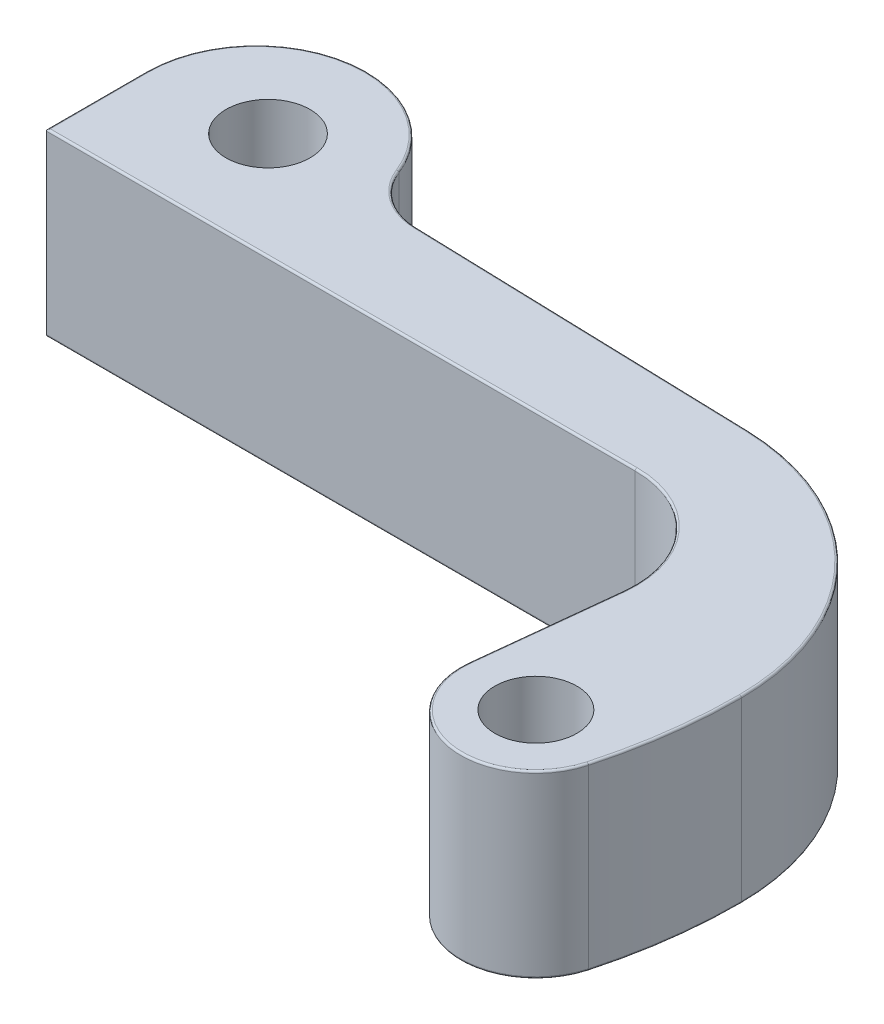
ISO-10303-21;
HEADER;
FILE_DESCRIPTION(('STEP AP214'),'2;1');
FILE_NAME('part.step','',(''),(''),'','','');
FILE_SCHEMA(('AUTOMOTIVE_DESIGN { 1 0 10303 214 1 1 1 1 }'));
ENDSEC;
DATA;
#1=APPLICATION_CONTEXT('core data for automotive mechanical design processes');
#2=APPLICATION_PROTOCOL_DEFINITION('international standard','automotive_design',2000,#1);
#3=PRODUCT_CONTEXT('',#1,'mechanical');
#4=PRODUCT('Part','Part','',(#3));
#5=PRODUCT_RELATED_PRODUCT_CATEGORY('part','',(#4));
#6=PRODUCT_DEFINITION_FORMATION('','',#4);
#7=PRODUCT_DEFINITION_CONTEXT('part definition',#1,'design');
#8=PRODUCT_DEFINITION('design','',#6,#7);
#9=PRODUCT_DEFINITION_SHAPE('','',#8);
#10=(LENGTH_UNIT() NAMED_UNIT(*) SI_UNIT(.MILLI.,.METRE.));
#11=(NAMED_UNIT(*) PLANE_ANGLE_UNIT() SI_UNIT($,.RADIAN.));
#12=(NAMED_UNIT(*) SI_UNIT($,.STERADIAN.) SOLID_ANGLE_UNIT());
#13=UNCERTAINTY_MEASURE_WITH_UNIT(LENGTH_MEASURE(1.E-05),#10,'distance_accuracy_value','');
#14=(GEOMETRIC_REPRESENTATION_CONTEXT(3) GLOBAL_UNCERTAINTY_ASSIGNED_CONTEXT((#13)) GLOBAL_UNIT_ASSIGNED_CONTEXT((#10,
#11,#12)) REPRESENTATION_CONTEXT('',''));
#15=CARTESIAN_POINT('',(0.,0.,0.));
#16=DIRECTION('',(0.,0.,1.));
#17=DIRECTION('',(1.,0.,0.));
#18=AXIS2_PLACEMENT_3D('',#15,#16,#17);
#19=CARTESIAN_POINT('',(11.,18.,-10.));
#20=DIRECTION('',(0.,1.,0.));
#21=DIRECTION('',(0.,0.,1.));
#22=AXIS2_PLACEMENT_3D('',#19,#20,#21);
#23=PLANE('',#22);
#24=CARTESIAN_POINT('',(11.,18.,-10.));
#25=DIRECTION('',(0.,1.,0.));
#26=DIRECTION('',(0.,0.,1.));
#27=AXIS2_PLACEMENT_3D('',#24,#25,#26);
#28=CIRCLE('',#27,10.8);
#29=CARTESIAN_POINT('',(21.05835728361,18.,-13.9331220112335));
#30=VERTEX_POINT('',#29);
#31=CARTESIAN_POINT('',(0.200000000000001,18.,-10.));
#32=VERTEX_POINT('',#31);
#33=EDGE_CURVE('E51',#30,#32,#28,.T.);
#34=ORIENTED_EDGE('',*,*,#33,.T.);
#35=DIRECTION('',(0.,0.,1.));
#36=VECTOR('',#35,1.);
#37=CARTESIAN_POINT('',(0.200000000000001,18.,0.));
#38=LINE('',#37,#36);
#39=CARTESIAN_POINT('',(0.200000000000001,18.,-0.200000000000001));
#40=VERTEX_POINT('',#39);
#41=EDGE_CURVE('E182',#32,#40,#38,.T.);
#42=ORIENTED_EDGE('',*,*,#41,.T.);
#43=DIRECTION('',(1.,0.,0.));
#44=VECTOR('',#43,1.);
#45=CARTESIAN_POINT('',(58.8497627682741,18.,-0.200000000000001));
#46=LINE('',#45,#44);
#47=CARTESIAN_POINT('',(58.8497627682741,18.,-0.200000000000001));
#48=VERTEX_POINT('',#47);
#49=EDGE_CURVE('E204',#40,#48,#46,.T.);
#50=ORIENTED_EDGE('',*,*,#49,.T.);
#51=CARTESIAN_POINT('',(58.8497627682742,18.,10.));
#52=DIRECTION('',(0.,1.,0.));
#53=DIRECTION('',(0.,0.,1.));
#54=AXIS2_PLACEMENT_3D('',#51,#52,#53);
#55=CIRCLE('',#54,10.2);
#56=CARTESIAN_POINT('',(68.9896049696757,18.,11.1061646037893));
#57=VERTEX_POINT('',#56);
#58=EDGE_CURVE('E369',#48,#57,#55,.F.);
#59=ORIENTED_EDGE('',*,*,#58,.T.);
#60=DIRECTION('',(-0.108447510175415,0.,0.994102176607995));
#61=VECTOR('',#60,1.);
#62=CARTESIAN_POINT('',(67.4715477080489,18.,25.0216895020351));
#63=LINE('',#62,#61);
#64=CARTESIAN_POINT('',(67.4715477080489,18.,25.0216895020351));
#65=VERTEX_POINT('',#64);
#66=EDGE_CURVE('E371',#57,#65,#63,.T.);
#67=ORIENTED_EDGE('',*,*,#66,.T.);
#68=CARTESIAN_POINT('',(74.7524218439286,18.,25.8159666804947));
#69=DIRECTION('',(0.,1.,0.));
#70=DIRECTION('',(0.,0.,1.));
#71=AXIS2_PLACEMENT_3D('',#68,#69,#70);
#72=CIRCLE('',#71,7.32407020847993);
#73=CARTESIAN_POINT('',(81.8120765527985,18.,27.7661666215967));
#74=VERTEX_POINT('',#73);
#75=EDGE_CURVE('E373',#65,#74,#72,.T.);
#76=ORIENTED_EDGE('',*,*,#75,.T.);
#77=CARTESIAN_POINT('',(33.5841333519381,18.,14.4434000177825));
#78=DIRECTION('',(0.,1.,0.));
#79=DIRECTION('',(0.,0.,1.));
#80=AXIS2_PLACEMENT_3D('',#77,#78,#79);
#81=CIRCLE('',#80,50.0342943925976);
#82=CARTESIAN_POINT('',(83.6183230539133,18.,14.3410465523556));
#83=VERTEX_POINT('',#82);
#84=EDGE_CURVE('E375',#74,#83,#81,.T.);
#85=ORIENTED_EDGE('',*,*,#84,.T.);
#86=CARTESIAN_POINT('',(60.4318787154034,18.,14.3884783773359));
#87=DIRECTION('',(0.,1.,0.));
#88=DIRECTION('',(0.,0.,1.));
#89=AXIS2_PLACEMENT_3D('',#86,#87,#88);
#90=CIRCLE('',#89,23.1864928534015);
#91=CARTESIAN_POINT('',(61.117955251726,18.,-8.78786192537682));
#92=VERTEX_POINT('',#91);
#93=EDGE_CURVE('E377',#83,#92,#90,.T.);
#94=ORIENTED_EDGE('',*,*,#93,.T.);
#95=DIRECTION('',(-0.999562135129579,0.,-0.0295894916346485));
#96=VECTOR('',#95,1.);
#97=CARTESIAN_POINT('',(26.9239771314506,18.,-9.80008757297408));
#98=LINE('',#97,#96);
#99=CARTESIAN_POINT('',(26.9239771314506,18.,-9.80008757297408));
#100=VERTEX_POINT('',#99);
#101=EDGE_CURVE('E379',#92,#100,#98,.T.);
#102=ORIENTED_EDGE('',*,*,#101,.T.);
#103=CARTESIAN_POINT('',(27.1164502736754,18.,-16.3020196565927));
#104=DIRECTION('',(0.,1.,0.));
#105=DIRECTION('',(0.,0.,1.));
#106=AXIS2_PLACEMENT_3D('',#103,#104,#105);
#107=CIRCLE('',#106,6.50478029840113);
#108=EDGE_CURVE('E56',#100,#30,#107,.F.);
#109=ORIENTED_EDGE('',*,*,#108,.T.);
#110=EDGE_LOOP('',(#34,#42,#50,#59,#67,#76,#85,#94,#102,#109));
#111=FACE_BOUND('',#110,.T.);
#112=CARTESIAN_POINT('',(11.5,18.,-10.6628696509577));
#113=DIRECTION('',(0.,1.,0.));
#114=DIRECTION('',(0.,0.,1.));
#115=AXIS2_PLACEMENT_3D('',#112,#113,#114);
#116=CIRCLE('',#115,4.2);
#117=CARTESIAN_POINT('',(11.5,18.,-6.46286965095767));
#118=VERTEX_POINT('',#117);
#119=EDGE_CURVE('E285',#118,#118,#116,.T.);
#120=ORIENTED_EDGE('',*,*,#119,.F.);
#121=EDGE_LOOP('',(#120));
#122=FACE_BOUND('',#121,.T.);
#123=CARTESIAN_POINT('',(74.7524218439286,18.,25.8159666804947));
#124=DIRECTION('',(0.,1.,0.));
#125=DIRECTION('',(0.,0.,1.));
#126=AXIS2_PLACEMENT_3D('',#123,#124,#125);
#127=CIRCLE('',#126,4.1);
#128=CARTESIAN_POINT('',(74.7524218439286,18.,29.9159666804947));
#129=VERTEX_POINT('',#128);
#130=EDGE_CURVE('E277',#129,#129,#127,.T.);
#131=ORIENTED_EDGE('',*,*,#130,.F.);
#132=EDGE_LOOP('',(#131));
#133=FACE_BOUND('',#132,.T.);
#134=ADVANCED_FACE('F34',(#111,#122,#133),#23,.T.);
#135=CARTESIAN_POINT('',(11.,0.,-10.));
#136=DIRECTION('',(0.,1.,0.));
#137=DIRECTION('',(0.,0.,1.));
#138=AXIS2_PLACEMENT_3D('',#135,#136,#137);
#139=PLANE('',#138);
#140=DIRECTION('',(1.,0.,0.));
#141=VECTOR('',#140,1.);
#142=CARTESIAN_POINT('',(11.,0.,-0.200000000000001));
#143=LINE('',#142,#141);
#144=CARTESIAN_POINT('',(58.8497627682741,0.,-0.2));
#145=VERTEX_POINT('',#144);
#146=CARTESIAN_POINT('',(0.2,0.,-0.2));
#147=VERTEX_POINT('',#146);
#148=EDGE_CURVE('E315',#145,#147,#143,.F.);
#149=ORIENTED_EDGE('',*,*,#148,.T.);
#150=DIRECTION('',(0.,0.,1.));
#151=VECTOR('',#150,1.);
#152=CARTESIAN_POINT('',(0.200000000000001,0.,-10.));
#153=LINE('',#152,#151);
#154=CARTESIAN_POINT('',(0.2,0.,-10.));
#155=VERTEX_POINT('',#154);
#156=EDGE_CURVE('E333',#147,#155,#153,.F.);
#157=ORIENTED_EDGE('',*,*,#156,.T.);
#158=CARTESIAN_POINT('',(11.,0.,-10.));
#159=DIRECTION('',(0.,1.,0.));
#160=DIRECTION('',(0.,0.,1.));
#161=AXIS2_PLACEMENT_3D('',#158,#159,#160);
#162=CIRCLE('',#161,10.8);
#163=CARTESIAN_POINT('',(21.05835728361,0.,-13.9331220112335));
#164=VERTEX_POINT('',#163);
#165=EDGE_CURVE('E331',#155,#164,#162,.F.);
#166=ORIENTED_EDGE('',*,*,#165,.T.);
#167=CARTESIAN_POINT('',(27.1164502736754,0.,-16.3020196565927));
#168=DIRECTION('',(0.,1.,0.));
#169=DIRECTION('',(0.,0.,1.));
#170=AXIS2_PLACEMENT_3D('',#167,#168,#169);
#171=CIRCLE('',#170,6.50478029840113);
#172=CARTESIAN_POINT('',(26.9239771314506,0.,-9.80008757297408));
#173=VERTEX_POINT('',#172);
#174=EDGE_CURVE('E329',#164,#173,#171,.T.);
#175=ORIENTED_EDGE('',*,*,#174,.T.);
#176=DIRECTION('',(-0.999562135129579,0.,-0.0295894916346485));
#177=VECTOR('',#176,1.);
#178=CARTESIAN_POINT('',(11.0080293303497,0.,-10.2712386778097));
#179=LINE('',#178,#177);
#180=CARTESIAN_POINT('',(61.117955251726,0.,-8.78786192537682));
#181=VERTEX_POINT('',#180);
#182=EDGE_CURVE('E327',#173,#181,#179,.F.);
#183=ORIENTED_EDGE('',*,*,#182,.T.);
#184=CARTESIAN_POINT('',(60.4318787154034,0.,14.3884783773359));
#185=DIRECTION('',(0.,1.,0.));
#186=DIRECTION('',(0.,0.,1.));
#187=AXIS2_PLACEMENT_3D('',#184,#185,#186);
#188=CIRCLE('',#187,23.1864928534015);
#189=CARTESIAN_POINT('',(83.6183230539133,0.,14.3410465523556));
#190=VERTEX_POINT('',#189);
#191=EDGE_CURVE('E325',#181,#190,#188,.F.);
#192=ORIENTED_EDGE('',*,*,#191,.T.);
#193=CARTESIAN_POINT('',(33.5841333519381,0.,14.4434000177825));
#194=DIRECTION('',(0.,1.,0.));
#195=DIRECTION('',(0.,0.,1.));
#196=AXIS2_PLACEMENT_3D('',#193,#194,#195);
#197=CIRCLE('',#196,50.0342943925976);
#198=CARTESIAN_POINT('',(81.8120765527985,0.,27.7661666215967));
#199=VERTEX_POINT('',#198);
#200=EDGE_CURVE('E323',#190,#199,#197,.F.);
#201=ORIENTED_EDGE('',*,*,#200,.T.);
#202=CARTESIAN_POINT('',(74.7524218439286,0.,25.8159666804947));
#203=DIRECTION('',(0.,1.,0.));
#204=DIRECTION('',(0.,0.,1.));
#205=AXIS2_PLACEMENT_3D('',#202,#203,#204);
#206=CIRCLE('',#205,7.32407020847993);
#207=CARTESIAN_POINT('',(67.4715477080489,0.,25.0216895020351));
#208=VERTEX_POINT('',#207);
#209=EDGE_CURVE('E321',#199,#208,#206,.F.);
#210=ORIENTED_EDGE('',*,*,#209,.T.);
#211=DIRECTION('',(-0.108447510175415,0.,0.994102176607995));
#212=VECTOR('',#211,1.);
#213=CARTESIAN_POINT('',(70.583008609121,0.,-3.50003542445966));
#214=LINE('',#213,#212);
#215=CARTESIAN_POINT('',(68.9896049696757,0.,11.1061646037893));
#216=VERTEX_POINT('',#215);
#217=EDGE_CURVE('E319',#208,#216,#214,.F.);
#218=ORIENTED_EDGE('',*,*,#217,.T.);
#219=CARTESIAN_POINT('',(58.8497627682742,0.,10.));
#220=DIRECTION('',(0.,1.,0.));
#221=DIRECTION('',(0.,0.,1.));
#222=AXIS2_PLACEMENT_3D('',#219,#220,#221);
#223=CIRCLE('',#222,10.2);
#224=EDGE_CURVE('E317',#216,#145,#223,.T.);
#225=ORIENTED_EDGE('',*,*,#224,.T.);
#226=EDGE_LOOP('',(#149,#157,#166,#175,#183,#192,#201,#210,#218,#225));
#227=FACE_BOUND('',#226,.T.);
#228=CARTESIAN_POINT('',(11.5,0.,-10.6628696509577));
#229=DIRECTION('',(0.,1.,0.));
#230=DIRECTION('',(0.,0.,1.));
#231=AXIS2_PLACEMENT_3D('',#228,#229,#230);
#232=CIRCLE('',#231,4.2);
#233=CARTESIAN_POINT('',(11.5,0.,-6.46286965095767));
#234=VERTEX_POINT('',#233);
#235=EDGE_CURVE('E282',#234,#234,#232,.T.);
#236=ORIENTED_EDGE('',*,*,#235,.T.);
#237=EDGE_LOOP('',(#236));
#238=FACE_BOUND('',#237,.T.);
#239=CARTESIAN_POINT('',(74.7524218439286,0.,25.8159666804947));
#240=DIRECTION('',(0.,1.,0.));
#241=DIRECTION('',(0.,0.,1.));
#242=AXIS2_PLACEMENT_3D('',#239,#240,#241);
#243=CIRCLE('',#242,4.1);
#244=CARTESIAN_POINT('',(74.7524218439286,0.,29.9159666804947));
#245=VERTEX_POINT('',#244);
#246=EDGE_CURVE('E271',#245,#245,#243,.T.);
#247=ORIENTED_EDGE('',*,*,#246,.T.);
#248=EDGE_LOOP('',(#247));
#249=FACE_BOUND('',#248,.T.);
#250=ADVANCED_FACE('F416',(#227,#238,#249),#139,.F.);
#251=CARTESIAN_POINT('',(0.,18.,0.));
#252=DIRECTION('',(1.,0.,0.));
#253=DIRECTION('',(0.,0.,-1.));
#254=AXIS2_PLACEMENT_3D('',#251,#252,#253);
#255=PLANE('',#254);
#256=DIRECTION('',(0.,-1.,0.));
#257=VECTOR('',#256,1.);
#258=CARTESIAN_POINT('',(0.,18.,-10.));
#259=LINE('',#258,#257);
#260=CARTESIAN_POINT('',(0.,17.8,-10.));
#261=VERTEX_POINT('',#260);
#262=CARTESIAN_POINT('',(0.,0.199999999999999,-10.));
#263=VERTEX_POINT('',#262);
#264=EDGE_CURVE('E288',#261,#263,#259,.T.);
#265=ORIENTED_EDGE('',*,*,#264,.T.);
#266=DIRECTION('',(0.,0.,1.));
#267=VECTOR('',#266,1.);
#268=CARTESIAN_POINT('',(0.,0.199999999999999,0.));
#269=LINE('',#268,#267);
#270=CARTESIAN_POINT('',(0.,0.199999999999999,0.));
#271=VERTEX_POINT('',#270);
#272=EDGE_CURVE('E193',#263,#271,#269,.T.);
#273=ORIENTED_EDGE('',*,*,#272,.T.);
#274=DIRECTION('',(0.,-1.,0.));
#275=VECTOR('',#274,1.);
#276=CARTESIAN_POINT('',(0.,18.,0.));
#277=LINE('',#276,#275);
#278=CARTESIAN_POINT('',(0.,17.8,0.));
#279=VERTEX_POINT('',#278);
#280=EDGE_CURVE('E175',#279,#271,#277,.T.);
#281=ORIENTED_EDGE('',*,*,#280,.F.);
#282=DIRECTION('',(0.,0.,1.));
#283=VECTOR('',#282,1.);
#284=CARTESIAN_POINT('',(0.,17.8,-10.));
#285=LINE('',#284,#283);
#286=EDGE_CURVE('E190',#279,#261,#285,.F.);
#287=ORIENTED_EDGE('',*,*,#286,.T.);
#288=EDGE_LOOP('',(#265,#273,#281,#287));
#289=FACE_BOUND('',#288,.T.);
#290=ADVANCED_FACE('F189',(#289),#255,.F.);
#291=CARTESIAN_POINT('',(0.,18.,0.));
#292=DIRECTION('',(0.,0.,-1.));
#293=DIRECTION('',(-1.,0.,0.));
#294=AXIS2_PLACEMENT_3D('',#291,#292,#293);
#295=PLANE('',#294);
#296=ORIENTED_EDGE('',*,*,#280,.T.);
#297=DIRECTION('',(1.,0.,0.));
#298=VECTOR('',#297,1.);
#299=CARTESIAN_POINT('',(0.,0.199999999999999,0.));
#300=LINE('',#299,#298);
#301=CARTESIAN_POINT('',(58.8497627682741,0.199999999999999,0.));
#302=VERTEX_POINT('',#301);
#303=EDGE_CURVE('E11',#271,#302,#300,.T.);
#304=ORIENTED_EDGE('',*,*,#303,.T.);
#305=DIRECTION('',(0.,-1.,0.));
#306=VECTOR('',#305,1.);
#307=CARTESIAN_POINT('',(58.8497627682741,18.,0.));
#308=LINE('',#307,#306);
#309=CARTESIAN_POINT('',(58.8497627682741,17.8,0.));
#310=VERTEX_POINT('',#309);
#311=EDGE_CURVE('E177',#310,#302,#308,.T.);
#312=ORIENTED_EDGE('',*,*,#311,.F.);
#313=DIRECTION('',(1.,0.,0.));
#314=VECTOR('',#313,1.);
#315=CARTESIAN_POINT('',(0.,17.8,0.));
#316=LINE('',#315,#314);
#317=EDGE_CURVE('E43',#310,#279,#316,.F.);
#318=ORIENTED_EDGE('',*,*,#317,.T.);
#319=EDGE_LOOP('',(#296,#304,#312,#318));
#320=FACE_BOUND('',#319,.T.);
#321=ADVANCED_FACE('F174',(#320),#295,.F.);
#322=CARTESIAN_POINT('',(58.8497627682742,18.,10.));
#323=DIRECTION('',(0.,-1.,0.));
#324=DIRECTION('',(0.,0.,-1.));
#325=AXIS2_PLACEMENT_3D('',#322,#323,#324);
#326=CYLINDRICAL_SURFACE('',#325,10.);
#327=ORIENTED_EDGE('',*,*,#311,.T.);
#328=CARTESIAN_POINT('',(58.8497627682742,0.199999999999999,10.));
#329=DIRECTION('',(0.,1.,0.));
#330=DIRECTION('',(0.,0.,1.));
#331=AXIS2_PLACEMENT_3D('',#328,#329,#330);
#332=CIRCLE('',#331,10.);
#333=CARTESIAN_POINT('',(68.7907845343541,0.199999999999999,11.0844751017542));
#334=VERTEX_POINT('',#333);
#335=EDGE_CURVE('E366',#302,#334,#332,.F.);
#336=ORIENTED_EDGE('',*,*,#335,.T.);
#337=DIRECTION('',(0.,-1.,0.));
#338=VECTOR('',#337,1.);
#339=CARTESIAN_POINT('',(68.7907845343541,18.,11.0844751017542));
#340=LINE('',#339,#338);
#341=CARTESIAN_POINT('',(68.7907845343541,17.8,11.0844751017542));
#342=VERTEX_POINT('',#341);
#343=EDGE_CURVE('E310',#342,#334,#340,.T.);
#344=ORIENTED_EDGE('',*,*,#343,.F.);
#345=CARTESIAN_POINT('',(58.8497627682742,17.8,10.));
#346=DIRECTION('',(0.,1.,0.));
#347=DIRECTION('',(0.,0.,1.));
#348=AXIS2_PLACEMENT_3D('',#345,#346,#347);
#349=CIRCLE('',#348,10.);
#350=EDGE_CURVE('E364',#342,#310,#349,.T.);
#351=ORIENTED_EDGE('',*,*,#350,.T.);
#352=EDGE_LOOP('',(#327,#336,#344,#351));
#353=FACE_BOUND('',#352,.T.);
#354=ADVANCED_FACE('F500',(#353),#326,.F.);
#355=CARTESIAN_POINT('',(68.7907845343541,18.,11.0844751017542));
#356=DIRECTION('',(0.994102176607995,0.,0.108447510175415));
#357=DIRECTION('',(0.108447510175415,0.,-0.994102176607995));
#358=AXIS2_PLACEMENT_3D('',#355,#356,#357);
#359=PLANE('',#358);
#360=ORIENTED_EDGE('',*,*,#343,.T.);
#361=DIRECTION('',(-0.108447510175415,0.,0.994102176607995));
#362=VECTOR('',#361,1.);
#363=CARTESIAN_POINT('',(68.7907845343541,0.199999999999999,11.0844751017542));
#364=LINE('',#363,#362);
#365=CARTESIAN_POINT('',(67.2727272727273,0.199999999999999,25.));
#366=VERTEX_POINT('',#365);
#367=EDGE_CURVE('E362',#334,#366,#364,.T.);
#368=ORIENTED_EDGE('',*,*,#367,.T.);
#369=DIRECTION('',(0.,-1.,0.));
#370=VECTOR('',#369,1.);
#371=CARTESIAN_POINT('',(67.2727272727273,18.,25.));
#372=LINE('',#371,#370);
#373=CARTESIAN_POINT('',(67.2727272727273,17.8,25.));
#374=VERTEX_POINT('',#373);
#375=EDGE_CURVE('E307',#374,#366,#372,.T.);
#376=ORIENTED_EDGE('',*,*,#375,.F.);
#377=DIRECTION('',(-0.108447510175415,0.,0.994102176607995));
#378=VECTOR('',#377,1.);
#379=CARTESIAN_POINT('',(68.7907845343541,17.8,11.0844751017542));
#380=LINE('',#379,#378);
#381=EDGE_CURVE('E360',#374,#342,#380,.F.);
#382=ORIENTED_EDGE('',*,*,#381,.T.);
#383=EDGE_LOOP('',(#360,#368,#376,#382));
#384=FACE_BOUND('',#383,.T.);
#385=ADVANCED_FACE('F401',(#384),#359,.F.);
#386=CARTESIAN_POINT('',(74.7524218439286,18.,25.8159666804947));
#387=DIRECTION('',(0.,-1.,0.));
#388=DIRECTION('',(0.,0.,-1.));
#389=AXIS2_PLACEMENT_3D('',#386,#387,#388);
#390=CYLINDRICAL_SURFACE('',#389,7.52407020847993);
#391=ORIENTED_EDGE('',*,*,#375,.T.);
#392=CARTESIAN_POINT('',(74.7524218439286,0.199999999999999,25.8159666804947));
#393=DIRECTION('',(0.,1.,0.));
#394=DIRECTION('',(0.,0.,1.));
#395=AXIS2_PLACEMENT_3D('',#392,#393,#394);
#396=CIRCLE('',#395,7.52407020847993);
#397=CARTESIAN_POINT('',(82.0048561004521,0.199999999999999,27.8194211613701));
#398=VERTEX_POINT('',#397);
#399=EDGE_CURVE('E358',#366,#398,#396,.T.);
#400=ORIENTED_EDGE('',*,*,#399,.T.);
#401=DIRECTION('',(0.,-1.,0.));
#402=VECTOR('',#401,1.);
#403=CARTESIAN_POINT('',(82.0048561004521,18.,27.8194211613701));
#404=LINE('',#403,#402);
#405=CARTESIAN_POINT('',(82.0048561004521,17.8,27.8194211613701));
#406=VERTEX_POINT('',#405);
#407=EDGE_CURVE('E304',#406,#398,#404,.T.);
#408=ORIENTED_EDGE('',*,*,#407,.F.);
#409=CARTESIAN_POINT('',(74.7524218439286,17.8,25.8159666804947));
#410=DIRECTION('',(0.,1.,0.));
#411=DIRECTION('',(0.,0.,1.));
#412=AXIS2_PLACEMENT_3D('',#409,#410,#411);
#413=CIRCLE('',#412,7.52407020847993);
#414=EDGE_CURVE('E356',#406,#374,#413,.F.);
#415=ORIENTED_EDGE('',*,*,#414,.T.);
#416=EDGE_LOOP('',(#391,#400,#408,#415));
#417=FACE_BOUND('',#416,.T.);
#418=ADVANCED_FACE('F399',(#417),#390,.T.);
#419=CARTESIAN_POINT('',(33.5841333519381,18.,14.4434000177825));
#420=DIRECTION('',(0.,-1.,0.));
#421=DIRECTION('',(0.,0.,-1.));
#422=AXIS2_PLACEMENT_3D('',#419,#420,#421);
#423=CYLINDRICAL_SURFACE('',#422,50.2342943925976);
#424=ORIENTED_EDGE('',*,*,#407,.T.);
#425=CARTESIAN_POINT('',(33.5841333519381,0.199999999999999,14.4434000177825));
#426=DIRECTION('',(0.,1.,0.));
#427=DIRECTION('',(0.,0.,1.));
#428=AXIS2_PLACEMENT_3D('',#425,#426,#427);
#429=CIRCLE('',#428,50.2342943925976);
#430=CARTESIAN_POINT('',(83.8183226354378,0.199999999999999,14.3406374191134));
#431=VERTEX_POINT('',#430);
#432=EDGE_CURVE('E354',#398,#431,#429,.T.);
#433=ORIENTED_EDGE('',*,*,#432,.T.);
#434=DIRECTION('',(0.,-1.,0.));
#435=VECTOR('',#434,1.);
#436=CARTESIAN_POINT('',(83.8183226354378,18.,14.3406374191134));
#437=LINE('',#436,#435);
#438=CARTESIAN_POINT('',(83.8183226354378,17.8,14.3406374191134));
#439=VERTEX_POINT('',#438);
#440=EDGE_CURVE('E301',#439,#431,#437,.T.);
#441=ORIENTED_EDGE('',*,*,#440,.F.);
#442=CARTESIAN_POINT('',(33.5841333519381,17.8,14.4434000177825));
#443=DIRECTION('',(0.,1.,0.));
#444=DIRECTION('',(0.,0.,1.));
#445=AXIS2_PLACEMENT_3D('',#442,#443,#444);
#446=CIRCLE('',#445,50.2342943925976);
#447=EDGE_CURVE('E352',#439,#406,#446,.F.);
#448=ORIENTED_EDGE('',*,*,#447,.T.);
#449=EDGE_LOOP('',(#424,#433,#441,#448));
#450=FACE_BOUND('',#449,.T.);
#451=ADVANCED_FACE('F422',(#450),#423,.T.);
#452=CARTESIAN_POINT('',(60.4318787154034,18.,14.3884783773359));
#453=DIRECTION('',(0.,-1.,0.));
#454=DIRECTION('',(0.,0.,-1.));
#455=AXIS2_PLACEMENT_3D('',#452,#453,#454);
#456=CYLINDRICAL_SURFACE('',#455,23.3864928534015);
#457=ORIENTED_EDGE('',*,*,#440,.T.);
#458=CARTESIAN_POINT('',(60.4318787154034,0.199999999999999,14.3884783773359));
#459=DIRECTION('',(0.,1.,0.));
#460=DIRECTION('',(0.,0.,1.));
#461=AXIS2_PLACEMENT_3D('',#458,#459,#460);
#462=CIRCLE('',#461,23.3864928534015);
#463=CARTESIAN_POINT('',(61.1238731500529,0.199999999999999,-8.98777435240273));
#464=VERTEX_POINT('',#463);
#465=EDGE_CURVE('E350',#431,#464,#462,.T.);
#466=ORIENTED_EDGE('',*,*,#465,.T.);
#467=DIRECTION('',(0.,-1.,0.));
#468=VECTOR('',#467,1.);
#469=CARTESIAN_POINT('',(61.1238731500529,18.,-8.98777435240273));
#470=LINE('',#469,#468);
#471=CARTESIAN_POINT('',(61.1238731500529,17.8,-8.98777435240273));
#472=VERTEX_POINT('',#471);
#473=EDGE_CURVE('E298',#472,#464,#470,.T.);
#474=ORIENTED_EDGE('',*,*,#473,.F.);
#475=CARTESIAN_POINT('',(60.4318787154034,17.8,14.3884783773359));
#476=DIRECTION('',(0.,1.,0.));
#477=DIRECTION('',(0.,0.,1.));
#478=AXIS2_PLACEMENT_3D('',#475,#476,#477);
#479=CIRCLE('',#478,23.3864928534015);
#480=EDGE_CURVE('E348',#472,#439,#479,.F.);
#481=ORIENTED_EDGE('',*,*,#480,.T.);
#482=EDGE_LOOP('',(#457,#466,#474,#481));
#483=FACE_BOUND('',#482,.T.);
#484=ADVANCED_FACE('F432',(#483),#456,.T.);
#485=CARTESIAN_POINT('',(26.9298950297775,18.,-10.));
#486=DIRECTION('',(-0.0295894916346485,0.,0.999562135129579));
#487=DIRECTION('',(0.999562135129579,0.,0.0295894916346485));
#488=AXIS2_PLACEMENT_3D('',#485,#486,#487);
#489=PLANE('',#488);
#490=ORIENTED_EDGE('',*,*,#473,.T.);
#491=DIRECTION('',(-0.999562135129579,0.,-0.0295894916346485));
#492=VECTOR('',#491,1.);
#493=CARTESIAN_POINT('',(26.9298950297775,0.199999999999999,-10.));
#494=LINE('',#493,#492);
#495=CARTESIAN_POINT('',(26.9298950297775,0.199999999999999,-10.));
#496=VERTEX_POINT('',#495);
#497=EDGE_CURVE('E346',#464,#496,#494,.T.);
#498=ORIENTED_EDGE('',*,*,#497,.T.);
#499=DIRECTION('',(0.,-1.,0.));
#500=VECTOR('',#499,1.);
#501=CARTESIAN_POINT('',(26.9298950297775,18.,-10.));
#502=LINE('',#501,#500);
#503=CARTESIAN_POINT('',(26.9298950297775,17.8,-10.));
#504=VERTEX_POINT('',#503);
#505=EDGE_CURVE('E295',#504,#496,#502,.T.);
#506=ORIENTED_EDGE('',*,*,#505,.F.);
#507=DIRECTION('',(-0.999562135129579,0.,-0.0295894916346485));
#508=VECTOR('',#507,1.);
#509=CARTESIAN_POINT('',(61.1238731500529,17.8,-8.98777435240274));
#510=LINE('',#509,#508);
#511=EDGE_CURVE('E344',#504,#472,#510,.F.);
#512=ORIENTED_EDGE('',*,*,#511,.T.);
#513=EDGE_LOOP('',(#490,#498,#506,#512));
#514=FACE_BOUND('',#513,.T.);
#515=ADVANCED_FACE('F434',(#514),#489,.F.);
#516=CARTESIAN_POINT('',(27.1164502736754,18.,-16.3020196565927));
#517=DIRECTION('',(0.,-1.,0.));
#518=DIRECTION('',(0.,0.,-1.));
#519=AXIS2_PLACEMENT_3D('',#516,#517,#518);
#520=CYLINDRICAL_SURFACE('',#519,6.30478029840113);
#521=ORIENTED_EDGE('',*,*,#505,.T.);
#522=CARTESIAN_POINT('',(27.1164502736754,0.199999999999999,-16.3020196565927));
#523=DIRECTION('',(0.,1.,0.));
#524=DIRECTION('',(0.,0.,1.));
#525=AXIS2_PLACEMENT_3D('',#522,#523,#524);
#526=CIRCLE('',#525,6.30478029840113);
#527=CARTESIAN_POINT('',(21.2446231592324,0.199999999999999,-14.0059576040341));
#528=VERTEX_POINT('',#527);
#529=EDGE_CURVE('E342',#496,#528,#526,.F.);
#530=ORIENTED_EDGE('',*,*,#529,.T.);
#531=DIRECTION('',(0.,-1.,0.));
#532=VECTOR('',#531,1.);
#533=CARTESIAN_POINT('',(21.2446231592324,18.,-14.0059576040341));
#534=LINE('',#533,#532);
#535=CARTESIAN_POINT('',(21.2446231592324,17.8,-14.0059576040341));
#536=VERTEX_POINT('',#535);
#537=EDGE_CURVE('E292',#536,#528,#534,.T.);
#538=ORIENTED_EDGE('',*,*,#537,.F.);
#539=CARTESIAN_POINT('',(27.1164502736754,17.8,-16.3020196565927));
#540=DIRECTION('',(0.,1.,0.));
#541=DIRECTION('',(0.,0.,1.));
#542=AXIS2_PLACEMENT_3D('',#539,#540,#541);
#543=CIRCLE('',#542,6.30478029840113);
#544=EDGE_CURVE('E340',#536,#504,#543,.T.);
#545=ORIENTED_EDGE('',*,*,#544,.T.);
#546=EDGE_LOOP('',(#521,#530,#538,#545));
#547=FACE_BOUND('',#546,.T.);
#548=ADVANCED_FACE('F452',(#547),#520,.F.);
#549=CARTESIAN_POINT('',(11.,18.,-10.));
#550=DIRECTION('',(0.,-1.,0.));
#551=DIRECTION('',(0.,0.,-1.));
#552=AXIS2_PLACEMENT_3D('',#549,#550,#551);
#553=CYLINDRICAL_SURFACE('',#552,11.);
#554=ORIENTED_EDGE('',*,*,#537,.T.);
#555=CARTESIAN_POINT('',(11.,0.199999999999999,-10.));
#556=DIRECTION('',(0.,1.,0.));
#557=DIRECTION('',(0.,0.,1.));
#558=AXIS2_PLACEMENT_3D('',#555,#556,#557);
#559=CIRCLE('',#558,11.);
#560=EDGE_CURVE('E338',#528,#263,#559,.T.);
#561=ORIENTED_EDGE('',*,*,#560,.T.);
#562=ORIENTED_EDGE('',*,*,#264,.F.);
#563=CARTESIAN_POINT('',(11.,17.8,-10.));
#564=DIRECTION('',(0.,1.,0.));
#565=DIRECTION('',(0.,0.,1.));
#566=AXIS2_PLACEMENT_3D('',#563,#564,#565);
#567=CIRCLE('',#566,11.);
#568=EDGE_CURVE('E336',#261,#536,#567,.F.);
#569=ORIENTED_EDGE('',*,*,#568,.T.);
#570=EDGE_LOOP('',(#554,#561,#562,#569));
#571=FACE_BOUND('',#570,.T.);
#572=ADVANCED_FACE('F449',(#571),#553,.T.);
#573=CARTESIAN_POINT('',(11.5,18.,-10.6628696509577));
#574=DIRECTION('',(0.,-1.,0.));
#575=DIRECTION('',(0.,0.,-1.));
#576=AXIS2_PLACEMENT_3D('',#573,#574,#575);
#577=CYLINDRICAL_SURFACE('',#576,4.2);
#578=ORIENTED_EDGE('',*,*,#119,.T.);
#579=EDGE_LOOP('',(#578));
#580=FACE_BOUND('',#579,.T.);
#581=ORIENTED_EDGE('',*,*,#235,.F.);
#582=EDGE_LOOP('',(#581));
#583=FACE_BOUND('',#582,.T.);
#584=ADVANCED_FACE('F483',(#580,#583),#577,.F.);
#585=CARTESIAN_POINT('',(74.7524218439286,18.,25.8159666804947));
#586=DIRECTION('',(0.,-1.,0.));
#587=DIRECTION('',(0.,0.,-1.));
#588=AXIS2_PLACEMENT_3D('',#585,#586,#587);
#589=CYLINDRICAL_SURFACE('',#588,4.1);
#590=ORIENTED_EDGE('',*,*,#130,.T.);
#591=EDGE_LOOP('',(#590));
#592=FACE_BOUND('',#591,.T.);
#593=ORIENTED_EDGE('',*,*,#246,.F.);
#594=EDGE_LOOP('',(#593));
#595=FACE_BOUND('',#594,.T.);
#596=ADVANCED_FACE('F553',(#592,#595),#589,.F.);
#597=CARTESIAN_POINT('',(33.5841333519381,0.199999999999999,14.4434000177825));
#598=DIRECTION('',(0.,1.,0.));
#599=DIRECTION('',(0.,0.,1.));
#600=AXIS2_PLACEMENT_3D('',#597,#598,#599);
#601=TOROIDAL_SURFACE('',#600,50.0342943925976,0.2);
#602=CARTESIAN_POINT('',(81.8120765527985,0.2,27.7661666215967));
#603=DIRECTION('',(-0.266272698866813,0.,0.963897738268009));
#604=DIRECTION('',(0.963897738268009,0.,0.266272698866813));
#605=AXIS2_PLACEMENT_3D('',#602,#603,#604);
#606=CIRCLE('',#605,0.2);
#607=EDGE_CURVE('E264',#199,#398,#606,.T.);
#608=ORIENTED_EDGE('',*,*,#607,.F.);
#609=ORIENTED_EDGE('',*,*,#200,.F.);
#610=CARTESIAN_POINT('',(83.6183230539133,0.199999999999999,14.3410465523556));
#611=DIRECTION('',(-0.00204566621093098,0.,-0.999997907622688));
#612=DIRECTION('',(-0.999997907622688,0.,0.00204566621093098));
#613=AXIS2_PLACEMENT_3D('',#610,#611,#612);
#614=CIRCLE('',#613,0.2);
#615=EDGE_CURVE('E209',#431,#190,#614,.T.);
#616=ORIENTED_EDGE('',*,*,#615,.F.);
#617=ORIENTED_EDGE('',*,*,#432,.F.);
#618=EDGE_LOOP('',(#608,#609,#616,#617));
#619=FACE_BOUND('',#618,.T.);
#620=ADVANCED_FACE('F426',(#619),#601,.T.);
#621=CARTESIAN_POINT('',(60.4318787154034,0.199999999999999,14.3884783773359));
#622=DIRECTION('',(0.,1.,0.));
#623=DIRECTION('',(0.,0.,1.));
#624=AXIS2_PLACEMENT_3D('',#621,#622,#623);
#625=TOROIDAL_SURFACE('',#624,23.1864928534015,0.2);
#626=ORIENTED_EDGE('',*,*,#615,.T.);
#627=ORIENTED_EDGE('',*,*,#191,.F.);
#628=CARTESIAN_POINT('',(61.117955251726,0.199999999999999,-8.78786192537682));
#629=DIRECTION('',(-0.999562135129579,0.,-0.0295894916346392));
#630=DIRECTION('',(-0.0295894916346392,0.,0.99956213512958));
#631=AXIS2_PLACEMENT_3D('',#628,#629,#630);
#632=CIRCLE('',#631,0.2);
#633=EDGE_CURVE('E262',#464,#181,#632,.T.);
#634=ORIENTED_EDGE('',*,*,#633,.F.);
#635=ORIENTED_EDGE('',*,*,#465,.F.);
#636=EDGE_LOOP('',(#626,#627,#634,#635));
#637=FACE_BOUND('',#636,.T.);
#638=ADVANCED_FACE('F428',(#637),#625,.T.);
#639=CARTESIAN_POINT('',(74.7524218439286,0.199999999999999,25.8159666804947));
#640=DIRECTION('',(0.,1.,0.));
#641=DIRECTION('',(0.,0.,1.));
#642=AXIS2_PLACEMENT_3D('',#639,#640,#641);
#643=TOROIDAL_SURFACE('',#642,7.32407020847993,0.2);
#644=ORIENTED_EDGE('',*,*,#607,.T.);
#645=ORIENTED_EDGE('',*,*,#399,.F.);
#646=CARTESIAN_POINT('',(67.4715477080489,0.2,25.0216895020351));
#647=DIRECTION('',(0.108447510175409,0.,-0.994102176607996));
#648=DIRECTION('',(-0.994102176607996,0.,-0.108447510175409));
#649=AXIS2_PLACEMENT_3D('',#646,#647,#648);
#650=CIRCLE('',#649,0.2);
#651=EDGE_CURVE('E259',#208,#366,#650,.T.);
#652=ORIENTED_EDGE('',*,*,#651,.F.);
#653=ORIENTED_EDGE('',*,*,#209,.F.);
#654=EDGE_LOOP('',(#644,#645,#652,#653));
#655=FACE_BOUND('',#654,.T.);
#656=ADVANCED_FACE('F419',(#655),#643,.T.);
#657=CARTESIAN_POINT('',(26.9239771314506,0.199999999999999,-9.80008757297408));
#658=DIRECTION('',(-0.999562135129579,0.,-0.0295894916346485));
#659=DIRECTION('',(-0.0295894916346485,0.,0.999562135129579));
#660=AXIS2_PLACEMENT_3D('',#657,#658,#659);
#661=CYLINDRICAL_SURFACE('',#660,0.2);
#662=ORIENTED_EDGE('',*,*,#633,.T.);
#663=ORIENTED_EDGE('',*,*,#182,.F.);
#664=CARTESIAN_POINT('',(26.9239771314506,0.199999999999999,-9.80008757297408));
#665=DIRECTION('',(-0.999562135129579,0.,-0.0295894916346565));
#666=DIRECTION('',(-0.0295894916346565,0.,0.999562135129579));
#667=AXIS2_PLACEMENT_3D('',#664,#665,#666);
#668=CIRCLE('',#667,0.2);
#669=EDGE_CURVE('E256',#496,#173,#668,.T.);
#670=ORIENTED_EDGE('',*,*,#669,.F.);
#671=ORIENTED_EDGE('',*,*,#497,.F.);
#672=EDGE_LOOP('',(#662,#663,#670,#671));
#673=FACE_BOUND('',#672,.T.);
#674=ADVANCED_FACE('F577',(#673),#661,.T.);
#675=CARTESIAN_POINT('',(68.9896049696757,0.199999999999999,11.1061646037893));
#676=DIRECTION('',(-0.108447510175415,0.,0.994102176607995));
#677=DIRECTION('',(0.994102176607995,0.,0.108447510175415));
#678=AXIS2_PLACEMENT_3D('',#675,#676,#677);
#679=CYLINDRICAL_SURFACE('',#678,0.2);
#680=ORIENTED_EDGE('',*,*,#651,.T.);
#681=ORIENTED_EDGE('',*,*,#367,.F.);
#682=CARTESIAN_POINT('',(68.9896049696757,0.2,11.1061646037893));
#683=DIRECTION('',(0.108447510175418,0.,-0.994102176607995));
#684=DIRECTION('',(-0.994102176607995,0.,-0.108447510175418));
#685=AXIS2_PLACEMENT_3D('',#682,#683,#684);
#686=CIRCLE('',#685,0.2);
#687=EDGE_CURVE('E253',#216,#334,#686,.T.);
#688=ORIENTED_EDGE('',*,*,#687,.F.);
#689=ORIENTED_EDGE('',*,*,#217,.F.);
#690=EDGE_LOOP('',(#680,#681,#688,#689));
#691=FACE_BOUND('',#690,.T.);
#692=ADVANCED_FACE('F406',(#691),#679,.T.);
#693=CARTESIAN_POINT('',(27.1164502736754,0.199999999999999,-16.3020196565927));
#694=DIRECTION('',(0.,1.,0.));
#695=DIRECTION('',(0.,0.,1.));
#696=AXIS2_PLACEMENT_3D('',#693,#694,#695);
#697=TOROIDAL_SURFACE('',#696,6.50478029840113,0.2);
#698=ORIENTED_EDGE('',*,*,#669,.T.);
#699=ORIENTED_EDGE('',*,*,#174,.F.);
#700=CARTESIAN_POINT('',(21.05835728361,0.199999999999999,-13.9331220112335));
#701=DIRECTION('',(-0.364177964003109,0.,-0.931329378112035));
#702=DIRECTION('',(-0.931329378112035,0.,0.364177964003109));
#703=AXIS2_PLACEMENT_3D('',#700,#701,#702);
#704=CIRCLE('',#703,0.2);
#705=EDGE_CURVE('E250',#528,#164,#704,.T.);
#706=ORIENTED_EDGE('',*,*,#705,.F.);
#707=ORIENTED_EDGE('',*,*,#529,.F.);
#708=EDGE_LOOP('',(#698,#699,#706,#707));
#709=FACE_BOUND('',#708,.T.);
#710=ADVANCED_FACE('F456',(#709),#697,.T.);
#711=CARTESIAN_POINT('',(58.8497627682742,0.199999999999999,10.));
#712=DIRECTION('',(0.,1.,0.));
#713=DIRECTION('',(0.,0.,1.));
#714=AXIS2_PLACEMENT_3D('',#711,#712,#713);
#715=TOROIDAL_SURFACE('',#714,10.2,0.2);
#716=ORIENTED_EDGE('',*,*,#687,.T.);
#717=ORIENTED_EDGE('',*,*,#335,.F.);
#718=CARTESIAN_POINT('',(58.8497627682741,0.2,-0.199999999999997));
#719=DIRECTION('',(-1.,0.,0.));
#720=DIRECTION('',(0.,0.,1.));
#721=AXIS2_PLACEMENT_3D('',#718,#719,#720);
#722=CIRCLE('',#721,0.2);
#723=EDGE_CURVE('E245',#145,#302,#722,.T.);
#724=ORIENTED_EDGE('',*,*,#723,.F.);
#725=ORIENTED_EDGE('',*,*,#224,.F.);
#726=EDGE_LOOP('',(#716,#717,#724,#725));
#727=FACE_BOUND('',#726,.T.);
#728=ADVANCED_FACE('F412',(#727),#715,.T.);
#729=CARTESIAN_POINT('',(11.,0.199999999999999,-10.));
#730=DIRECTION('',(0.,1.,0.));
#731=DIRECTION('',(0.,0.,1.));
#732=AXIS2_PLACEMENT_3D('',#729,#730,#731);
#733=TOROIDAL_SURFACE('',#732,10.8,0.2);
#734=ORIENTED_EDGE('',*,*,#705,.T.);
#735=ORIENTED_EDGE('',*,*,#165,.F.);
#736=CARTESIAN_POINT('',(0.2,0.199999999999999,-10.));
#737=DIRECTION('',(0.,0.,1.));
#738=DIRECTION('',(1.,0.,0.));
#739=AXIS2_PLACEMENT_3D('',#736,#737,#738);
#740=CIRCLE('',#739,0.2);
#741=EDGE_CURVE('E239',#263,#155,#740,.T.);
#742=ORIENTED_EDGE('',*,*,#741,.F.);
#743=ORIENTED_EDGE('',*,*,#560,.F.);
#744=EDGE_LOOP('',(#734,#735,#742,#743));
#745=FACE_BOUND('',#744,.T.);
#746=ADVANCED_FACE('F462',(#745),#733,.T.);
#747=CARTESIAN_POINT('',(0.,0.199999999999999,-0.2));
#748=DIRECTION('',(1.,0.,0.));
#749=DIRECTION('',(0.,0.,-1.));
#750=AXIS2_PLACEMENT_3D('',#747,#748,#749);
#751=CYLINDRICAL_SURFACE('',#750,0.2);
#752=ORIENTED_EDGE('',*,*,#723,.T.);
#753=ORIENTED_EDGE('',*,*,#303,.F.);
#754=CARTESIAN_POINT('',(0.2,0.199999999999999,-0.2));
#755=DIRECTION('',(0.707106781186547,0.,0.707106781186547));
#756=DIRECTION('',(0.707106781186547,0.,-0.707106781186547));
#757=AXIS2_PLACEMENT_3D('',#754,#755,#756);
#758=ELLIPSE('',#757,0.282842712474619,0.2);
#759=EDGE_CURVE('E234',#147,#271,#758,.F.);
#760=ORIENTED_EDGE('',*,*,#759,.F.);
#761=ORIENTED_EDGE('',*,*,#148,.F.);
#762=EDGE_LOOP('',(#752,#753,#760,#761));
#763=FACE_BOUND('',#762,.T.);
#764=ADVANCED_FACE('F465',(#763),#751,.T.);
#765=CARTESIAN_POINT('',(0.2,0.199999999999999,0.));
#766=DIRECTION('',(0.,0.,1.));
#767=DIRECTION('',(1.,0.,0.));
#768=AXIS2_PLACEMENT_3D('',#765,#766,#767);
#769=CYLINDRICAL_SURFACE('',#768,0.2);
#770=ORIENTED_EDGE('',*,*,#741,.T.);
#771=ORIENTED_EDGE('',*,*,#156,.F.);
#772=ORIENTED_EDGE('',*,*,#759,.T.);
#773=ORIENTED_EDGE('',*,*,#272,.F.);
#774=EDGE_LOOP('',(#770,#771,#772,#773));
#775=FACE_BOUND('',#774,.T.);
#776=ADVANCED_FACE('F463',(#775),#769,.T.);
#777=CARTESIAN_POINT('',(33.5841333519381,17.8,14.4434000177825));
#778=DIRECTION('',(0.,1.,0.));
#779=DIRECTION('',(0.,0.,1.));
#780=AXIS2_PLACEMENT_3D('',#777,#778,#779);
#781=TOROIDAL_SURFACE('',#780,50.0342943925976,0.2);
#782=CARTESIAN_POINT('',(81.8120765527985,17.8,27.7661666215967));
#783=DIRECTION('',(-0.266272698866813,0.,0.963897738268009));
#784=DIRECTION('',(0.963897738268009,0.,0.266272698866813));
#785=AXIS2_PLACEMENT_3D('',#782,#783,#784);
#786=CIRCLE('',#785,0.2);
#787=EDGE_CURVE('E227',#406,#74,#786,.T.);
#788=ORIENTED_EDGE('',*,*,#787,.F.);
#789=ORIENTED_EDGE('',*,*,#447,.F.);
#790=CARTESIAN_POINT('',(83.6183230539133,17.8,14.3410465523556));
#791=DIRECTION('',(-0.00204566621093098,0.,-0.999997907622688));
#792=DIRECTION('',(-0.999997907622688,0.,0.00204566621093098));
#793=AXIS2_PLACEMENT_3D('',#790,#791,#792);
#794=CIRCLE('',#793,0.2);
#795=EDGE_CURVE('E38',#83,#439,#794,.T.);
#796=ORIENTED_EDGE('',*,*,#795,.F.);
#797=ORIENTED_EDGE('',*,*,#84,.F.);
#798=EDGE_LOOP('',(#788,#789,#796,#797));
#799=FACE_BOUND('',#798,.T.);
#800=ADVANCED_FACE('F36',(#799),#781,.T.);
#801=CARTESIAN_POINT('',(60.4318787154034,17.8,14.3884783773359));
#802=DIRECTION('',(0.,1.,0.));
#803=DIRECTION('',(0.,0.,1.));
#804=AXIS2_PLACEMENT_3D('',#801,#802,#803);
#805=TOROIDAL_SURFACE('',#804,23.1864928534015,0.2);
#806=ORIENTED_EDGE('',*,*,#795,.T.);
#807=ORIENTED_EDGE('',*,*,#480,.F.);
#808=CARTESIAN_POINT('',(61.117955251726,17.8,-8.78786192537682));
#809=DIRECTION('',(-0.999562135129579,0.,-0.0295894916346397));
#810=DIRECTION('',(-0.0295894916346397,0.,0.999562135129579));
#811=AXIS2_PLACEMENT_3D('',#808,#809,#810);
#812=CIRCLE('',#811,0.2);
#813=EDGE_CURVE('E225',#92,#472,#812,.T.);
#814=ORIENTED_EDGE('',*,*,#813,.F.);
#815=ORIENTED_EDGE('',*,*,#93,.F.);
#816=EDGE_LOOP('',(#806,#807,#814,#815));
#817=FACE_BOUND('',#816,.T.);
#818=ADVANCED_FACE('F471',(#817),#805,.T.);
#819=CARTESIAN_POINT('',(74.7524218439286,17.8,25.8159666804947));
#820=DIRECTION('',(0.,1.,0.));
#821=DIRECTION('',(0.,0.,1.));
#822=AXIS2_PLACEMENT_3D('',#819,#820,#821);
#823=TOROIDAL_SURFACE('',#822,7.32407020847993,0.2);
#824=ORIENTED_EDGE('',*,*,#787,.T.);
#825=ORIENTED_EDGE('',*,*,#75,.F.);
#826=CARTESIAN_POINT('',(67.4715477080489,17.8,25.0216895020351));
#827=DIRECTION('',(0.108447510175409,0.,-0.994102176607996));
#828=DIRECTION('',(-0.994102176607996,0.,-0.108447510175409));
#829=AXIS2_PLACEMENT_3D('',#826,#827,#828);
#830=CIRCLE('',#829,0.2);
#831=EDGE_CURVE('E222',#374,#65,#830,.T.);
#832=ORIENTED_EDGE('',*,*,#831,.F.);
#833=ORIENTED_EDGE('',*,*,#414,.F.);
#834=EDGE_LOOP('',(#824,#825,#832,#833));
#835=FACE_BOUND('',#834,.T.);
#836=ADVANCED_FACE('F395',(#835),#823,.T.);
#837=CARTESIAN_POINT('',(11.0080293303497,17.8,-10.2712386778097));
#838=DIRECTION('',(0.999562135129579,0.,0.0295894916346485));
#839=DIRECTION('',(0.0295894916346485,0.,-0.999562135129579));
#840=AXIS2_PLACEMENT_3D('',#837,#838,#839);
#841=CYLINDRICAL_SURFACE('',#840,0.2);
#842=ORIENTED_EDGE('',*,*,#813,.T.);
#843=ORIENTED_EDGE('',*,*,#511,.F.);
#844=CARTESIAN_POINT('',(26.9239771314506,17.8,-9.80008757297408));
#845=DIRECTION('',(-0.999562135129579,0.,-0.0295894916346565));
#846=DIRECTION('',(-0.0295894916346565,0.,0.999562135129579));
#847=AXIS2_PLACEMENT_3D('',#844,#845,#846);
#848=CIRCLE('',#847,0.2);
#849=EDGE_CURVE('E219',#100,#504,#848,.T.);
#850=ORIENTED_EDGE('',*,*,#849,.F.);
#851=ORIENTED_EDGE('',*,*,#101,.F.);
#852=EDGE_LOOP('',(#842,#843,#850,#851));
#853=FACE_BOUND('',#852,.T.);
#854=ADVANCED_FACE('F439',(#853),#841,.T.);
#855=CARTESIAN_POINT('',(70.583008609121,17.8,-3.50003542445966));
#856=DIRECTION('',(0.108447510175415,0.,-0.994102176607995));
#857=DIRECTION('',(-0.994102176607995,0.,-0.108447510175415));
#858=AXIS2_PLACEMENT_3D('',#855,#856,#857);
#859=CYLINDRICAL_SURFACE('',#858,0.2);
#860=ORIENTED_EDGE('',*,*,#831,.T.);
#861=ORIENTED_EDGE('',*,*,#66,.F.);
#862=CARTESIAN_POINT('',(68.9896049696757,17.8,11.1061646037893));
#863=DIRECTION('',(0.108447510175418,0.,-0.994102176607995));
#864=DIRECTION('',(-0.994102176607995,0.,-0.108447510175418));
#865=AXIS2_PLACEMENT_3D('',#862,#863,#864);
#866=CIRCLE('',#865,0.2);
#867=EDGE_CURVE('E216',#342,#57,#866,.T.);
#868=ORIENTED_EDGE('',*,*,#867,.F.);
#869=ORIENTED_EDGE('',*,*,#381,.F.);
#870=EDGE_LOOP('',(#860,#861,#868,#869));
#871=FACE_BOUND('',#870,.T.);
#872=ADVANCED_FACE('F392',(#871),#859,.T.);
#873=CARTESIAN_POINT('',(27.1164502736754,17.8,-16.3020196565927));
#874=DIRECTION('',(0.,1.,0.));
#875=DIRECTION('',(0.,0.,1.));
#876=AXIS2_PLACEMENT_3D('',#873,#874,#875);
#877=TOROIDAL_SURFACE('',#876,6.50478029840113,0.2);
#878=ORIENTED_EDGE('',*,*,#849,.T.);
#879=ORIENTED_EDGE('',*,*,#544,.F.);
#880=CARTESIAN_POINT('',(21.05835728361,17.8,-13.9331220112335));
#881=DIRECTION('',(-0.364177964003109,0.,-0.931329378112035));
#882=DIRECTION('',(-0.931329378112035,0.,0.364177964003109));
#883=AXIS2_PLACEMENT_3D('',#880,#881,#882);
#884=CIRCLE('',#883,0.2);
#885=EDGE_CURVE('E213',#30,#536,#884,.T.);
#886=ORIENTED_EDGE('',*,*,#885,.F.);
#887=ORIENTED_EDGE('',*,*,#108,.F.);
#888=EDGE_LOOP('',(#878,#879,#886,#887));
#889=FACE_BOUND('',#888,.T.);
#890=ADVANCED_FACE('F444',(#889),#877,.T.);
#891=CARTESIAN_POINT('',(58.8497627682742,17.8,10.));
#892=DIRECTION('',(0.,1.,0.));
#893=DIRECTION('',(0.,0.,1.));
#894=AXIS2_PLACEMENT_3D('',#891,#892,#893);
#895=TOROIDAL_SURFACE('',#894,10.2,0.2);
#896=ORIENTED_EDGE('',*,*,#867,.T.);
#897=ORIENTED_EDGE('',*,*,#58,.F.);
#898=CARTESIAN_POINT('',(58.8497627682741,17.8,-0.199999999999997));
#899=DIRECTION('',(-1.,0.,0.));
#900=DIRECTION('',(0.,0.,1.));
#901=AXIS2_PLACEMENT_3D('',#898,#899,#900);
#902=CIRCLE('',#901,0.2);
#903=EDGE_CURVE('E206',#310,#48,#902,.T.);
#904=ORIENTED_EDGE('',*,*,#903,.F.);
#905=ORIENTED_EDGE('',*,*,#350,.F.);
#906=EDGE_LOOP('',(#896,#897,#904,#905));
#907=FACE_BOUND('',#906,.T.);
#908=ADVANCED_FACE('F387',(#907),#895,.T.);
#909=CARTESIAN_POINT('',(11.,17.8,-10.));
#910=DIRECTION('',(0.,1.,0.));
#911=DIRECTION('',(0.,0.,1.));
#912=AXIS2_PLACEMENT_3D('',#909,#910,#911);
#913=TOROIDAL_SURFACE('',#912,10.8,0.2);
#914=ORIENTED_EDGE('',*,*,#885,.T.);
#915=ORIENTED_EDGE('',*,*,#568,.F.);
#916=CARTESIAN_POINT('',(0.200000000000001,17.8,-10.));
#917=DIRECTION('',(0.,0.,1.));
#918=DIRECTION('',(1.,0.,0.));
#919=AXIS2_PLACEMENT_3D('',#916,#917,#918);
#920=CIRCLE('',#919,0.2);
#921=EDGE_CURVE('E200',#32,#261,#920,.T.);
#922=ORIENTED_EDGE('',*,*,#921,.F.);
#923=ORIENTED_EDGE('',*,*,#33,.F.);
#924=EDGE_LOOP('',(#914,#915,#922,#923));
#925=FACE_BOUND('',#924,.T.);
#926=ADVANCED_FACE('F446',(#925),#913,.T.);
#927=CARTESIAN_POINT('',(11.,17.8,-0.200000000000001));
#928=DIRECTION('',(-1.,0.,0.));
#929=DIRECTION('',(0.,0.,1.));
#930=AXIS2_PLACEMENT_3D('',#927,#928,#929);
#931=CYLINDRICAL_SURFACE('',#930,0.2);
#932=ORIENTED_EDGE('',*,*,#903,.T.);
#933=ORIENTED_EDGE('',*,*,#49,.F.);
#934=CARTESIAN_POINT('',(0.200000000000001,17.8,-0.200000000000001));
#935=DIRECTION('',(-0.707106781186547,0.,-0.707106781186547));
#936=DIRECTION('',(-0.707106781186547,0.,0.707106781186547));
#937=AXIS2_PLACEMENT_3D('',#934,#935,#936);
#938=ELLIPSE('',#937,0.282842712474619,0.2);
#939=EDGE_CURVE('E198',#279,#40,#938,.T.);
#940=ORIENTED_EDGE('',*,*,#939,.F.);
#941=ORIENTED_EDGE('',*,*,#317,.F.);
#942=EDGE_LOOP('',(#932,#933,#940,#941));
#943=FACE_BOUND('',#942,.T.);
#944=ADVANCED_FACE('F203',(#943),#931,.T.);
#945=CARTESIAN_POINT('',(0.200000000000001,17.8,-10.));
#946=DIRECTION('',(0.,0.,-1.));
#947=DIRECTION('',(-1.,0.,0.));
#948=AXIS2_PLACEMENT_3D('',#945,#946,#947);
#949=CYLINDRICAL_SURFACE('',#948,0.2);
#950=ORIENTED_EDGE('',*,*,#921,.T.);
#951=ORIENTED_EDGE('',*,*,#286,.F.);
#952=ORIENTED_EDGE('',*,*,#939,.T.);
#953=ORIENTED_EDGE('',*,*,#41,.F.);
#954=EDGE_LOOP('',(#950,#951,#952,#953));
#955=FACE_BOUND('',#954,.T.);
#956=ADVANCED_FACE('F196',(#955),#949,.T.);
#957=CLOSED_SHELL('',(#134,#250,#290,#321,#354,#385,#418,#451,#484,#515,#548,#572,#584,#596,
#620,#638,#656,#674,#692,#710,#728,#746,#764,#776,#800,#818,#836,#854,#872,#890,#908,#926,#944,#956));
#958=MANIFOLD_SOLID_BREP('B2',#957);
#959=ADVANCED_BREP_SHAPE_REPRESENTATION('',(#18,#958),#14);
#960=SHAPE_DEFINITION_REPRESENTATION(#9,#959);
ENDSEC;
END-ISO-10303-21;
